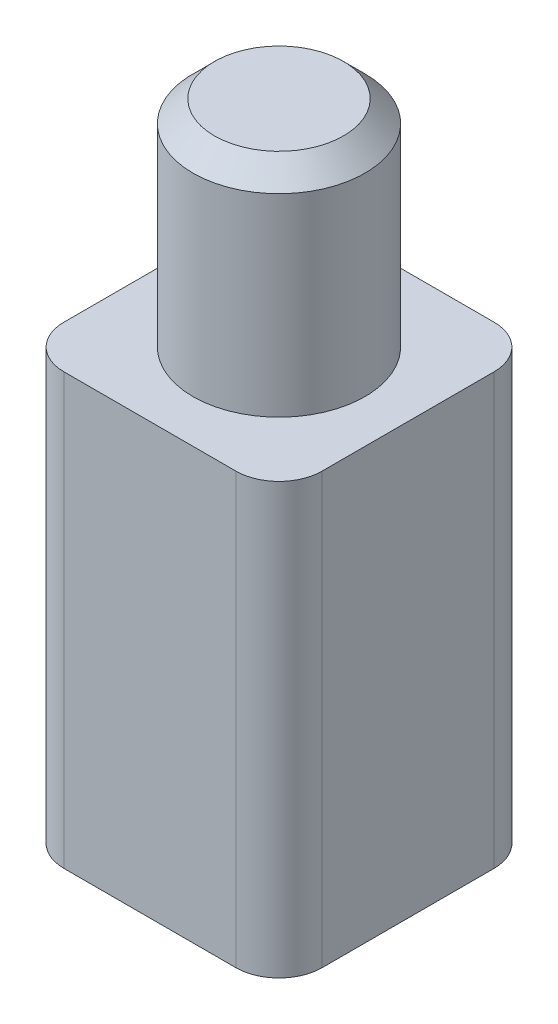
ISO-10303-21;
HEADER;
FILE_DESCRIPTION(('STEP AP214'),'2;1');
FILE_NAME('part.step','',(''),(''),'','','');
FILE_SCHEMA(('AUTOMOTIVE_DESIGN { 1 0 10303 214 1 1 1 1 }'));
ENDSEC;
DATA;
#1=APPLICATION_CONTEXT('core data for automotive mechanical design processes');
#2=APPLICATION_PROTOCOL_DEFINITION('international standard','automotive_design',2000,#1);
#3=PRODUCT_CONTEXT('',#1,'mechanical');
#4=PRODUCT('Part','Part','',(#3));
#5=PRODUCT_RELATED_PRODUCT_CATEGORY('part','',(#4));
#6=PRODUCT_DEFINITION_FORMATION('','',#4);
#7=PRODUCT_DEFINITION_CONTEXT('part definition',#1,'design');
#8=PRODUCT_DEFINITION('design','',#6,#7);
#9=PRODUCT_DEFINITION_SHAPE('','',#8);
#10=(LENGTH_UNIT() NAMED_UNIT(*) SI_UNIT(.MILLI.,.METRE.));
#11=(NAMED_UNIT(*) PLANE_ANGLE_UNIT() SI_UNIT($,.RADIAN.));
#12=(NAMED_UNIT(*) SI_UNIT($,.STERADIAN.) SOLID_ANGLE_UNIT());
#13=UNCERTAINTY_MEASURE_WITH_UNIT(LENGTH_MEASURE(1.E-05),#10,'distance_accuracy_value','');
#14=(GEOMETRIC_REPRESENTATION_CONTEXT(3) GLOBAL_UNCERTAINTY_ASSIGNED_CONTEXT((#13)) GLOBAL_UNIT_ASSIGNED_CONTEXT((#10,
#11,#12)) REPRESENTATION_CONTEXT('',''));
#15=CARTESIAN_POINT('',(0.,0.,0.));
#16=DIRECTION('',(0.,0.,1.));
#17=DIRECTION('',(1.,0.,0.));
#18=AXIS2_PLACEMENT_3D('',#15,#16,#17);
#19=CARTESIAN_POINT('',(-30.,100.,-30.));
#20=DIRECTION('',(0.,0.,-1.));
#21=DIRECTION('',(-1.,0.,0.));
#22=AXIS2_PLACEMENT_3D('',#19,#20,#21);
#23=PLANE('',#22);
#24=DIRECTION('',(1.,0.,0.));
#25=VECTOR('',#24,1.);
#26=CARTESIAN_POINT('',(-30.,100.,-30.));
#27=LINE('',#26,#25);
#28=CARTESIAN_POINT('',(-20.,100.,-30.));
#29=VERTEX_POINT('',#28);
#30=CARTESIAN_POINT('',(20.,100.,-30.));
#31=VERTEX_POINT('',#30);
#32=EDGE_CURVE('E348',#29,#31,#27,.T.);
#33=ORIENTED_EDGE('',*,*,#32,.T.);
#34=DIRECTION('',(0.,-1.,0.));
#35=VECTOR('',#34,1.);
#36=CARTESIAN_POINT('',(20.,0.,-30.));
#37=LINE('',#36,#35);
#38=CARTESIAN_POINT('',(20.,0.,-30.));
#39=VERTEX_POINT('',#38);
#40=EDGE_CURVE('E174',#31,#39,#37,.T.);
#41=ORIENTED_EDGE('',*,*,#40,.T.);
#42=DIRECTION('',(1.,0.,0.));
#43=VECTOR('',#42,1.);
#44=CARTESIAN_POINT('',(-30.,0.,-30.));
#45=LINE('',#44,#43);
#46=CARTESIAN_POINT('',(-20.,0.,-30.));
#47=VERTEX_POINT('',#46);
#48=EDGE_CURVE('E158',#47,#39,#45,.T.);
#49=ORIENTED_EDGE('',*,*,#48,.F.);
#50=DIRECTION('',(0.,-1.,0.));
#51=VECTOR('',#50,1.);
#52=CARTESIAN_POINT('',(-20.,100.,-30.));
#53=LINE('',#52,#51);
#54=EDGE_CURVE('E171',#47,#29,#53,.F.);
#55=ORIENTED_EDGE('',*,*,#54,.T.);
#56=EDGE_LOOP('',(#33,#41,#49,#55));
#57=FACE_BOUND('',#56,.T.);
#58=ADVANCED_FACE('F39',(#57),#23,.T.);
#59=CARTESIAN_POINT('',(-30.,100.,30.));
#60=DIRECTION('',(-1.,0.,0.));
#61=DIRECTION('',(0.,0.,1.));
#62=AXIS2_PLACEMENT_3D('',#59,#60,#61);
#63=PLANE('',#62);
#64=DIRECTION('',(0.,0.,-1.));
#65=VECTOR('',#64,1.);
#66=CARTESIAN_POINT('',(-30.,100.,30.));
#67=LINE('',#66,#65);
#68=CARTESIAN_POINT('',(-30.,100.,20.));
#69=VERTEX_POINT('',#68);
#70=CARTESIAN_POINT('',(-30.,100.,-20.));
#71=VERTEX_POINT('',#70);
#72=EDGE_CURVE('E186',#69,#71,#67,.T.);
#73=ORIENTED_EDGE('',*,*,#72,.T.);
#74=DIRECTION('',(0.,-1.,0.));
#75=VECTOR('',#74,1.);
#76=CARTESIAN_POINT('',(-30.,100.,-20.));
#77=LINE('',#76,#75);
#78=CARTESIAN_POINT('',(-30.,0.,-20.));
#79=VERTEX_POINT('',#78);
#80=EDGE_CURVE('E208',#71,#79,#77,.T.);
#81=ORIENTED_EDGE('',*,*,#80,.T.);
#82=DIRECTION('',(0.,0.,-1.));
#83=VECTOR('',#82,1.);
#84=CARTESIAN_POINT('',(-30.,0.,30.));
#85=LINE('',#84,#83);
#86=CARTESIAN_POINT('',(-30.,0.,20.));
#87=VERTEX_POINT('',#86);
#88=EDGE_CURVE('E160',#87,#79,#85,.T.);
#89=ORIENTED_EDGE('',*,*,#88,.F.);
#90=DIRECTION('',(0.,-1.,0.));
#91=VECTOR('',#90,1.);
#92=CARTESIAN_POINT('',(-30.,100.,20.));
#93=LINE('',#92,#91);
#94=EDGE_CURVE('E206',#87,#69,#93,.F.);
#95=ORIENTED_EDGE('',*,*,#94,.T.);
#96=EDGE_LOOP('',(#73,#81,#89,#95));
#97=FACE_BOUND('',#96,.T.);
#98=ADVANCED_FACE('F268',(#97),#63,.T.);
#99=CARTESIAN_POINT('',(-30.,100.,30.));
#100=DIRECTION('',(0.,0.,-1.));
#101=DIRECTION('',(-1.,0.,0.));
#102=AXIS2_PLACEMENT_3D('',#99,#100,#101);
#103=PLANE('',#102);
#104=DIRECTION('',(1.,0.,0.));
#105=VECTOR('',#104,1.);
#106=CARTESIAN_POINT('',(-30.,0.,30.));
#107=LINE('',#106,#105);
#108=CARTESIAN_POINT('',(-20.,0.,30.));
#109=VERTEX_POINT('',#108);
#110=CARTESIAN_POINT('',(20.,0.,30.));
#111=VERTEX_POINT('',#110);
#112=EDGE_CURVE('E359',#109,#111,#107,.T.);
#113=ORIENTED_EDGE('',*,*,#112,.T.);
#114=DIRECTION('',(0.,-1.,0.));
#115=VECTOR('',#114,1.);
#116=CARTESIAN_POINT('',(20.,100.,30.));
#117=LINE('',#116,#115);
#118=CARTESIAN_POINT('',(20.,100.,30.));
#119=VERTEX_POINT('',#118);
#120=EDGE_CURVE('E213',#111,#119,#117,.F.);
#121=ORIENTED_EDGE('',*,*,#120,.T.);
#122=DIRECTION('',(1.,0.,0.));
#123=VECTOR('',#122,1.);
#124=CARTESIAN_POINT('',(-30.,100.,30.));
#125=LINE('',#124,#123);
#126=CARTESIAN_POINT('',(-20.,100.,30.));
#127=VERTEX_POINT('',#126);
#128=EDGE_CURVE('E353',#127,#119,#125,.T.);
#129=ORIENTED_EDGE('',*,*,#128,.F.);
#130=DIRECTION('',(0.,-1.,0.));
#131=VECTOR('',#130,1.);
#132=CARTESIAN_POINT('',(-20.,0.,30.));
#133=LINE('',#132,#131);
#134=EDGE_CURVE('E210',#127,#109,#133,.T.);
#135=ORIENTED_EDGE('',*,*,#134,.T.);
#136=EDGE_LOOP('',(#113,#121,#129,#135));
#137=FACE_BOUND('',#136,.T.);
#138=ADVANCED_FACE('F273',(#137),#103,.F.);
#139=CARTESIAN_POINT('',(30.,100.,30.));
#140=DIRECTION('',(-1.,0.,0.));
#141=DIRECTION('',(0.,0.,1.));
#142=AXIS2_PLACEMENT_3D('',#139,#140,#141);
#143=PLANE('',#142);
#144=DIRECTION('',(0.,0.,-1.));
#145=VECTOR('',#144,1.);
#146=CARTESIAN_POINT('',(30.,0.,30.));
#147=LINE('',#146,#145);
#148=CARTESIAN_POINT('',(30.,0.,20.));
#149=VERTEX_POINT('',#148);
#150=CARTESIAN_POINT('',(30.,0.,-20.));
#151=VERTEX_POINT('',#150);
#152=EDGE_CURVE('E175',#149,#151,#147,.T.);
#153=ORIENTED_EDGE('',*,*,#152,.T.);
#154=DIRECTION('',(0.,-1.,0.));
#155=VECTOR('',#154,1.);
#156=CARTESIAN_POINT('',(30.,100.,-20.));
#157=LINE('',#156,#155);
#158=CARTESIAN_POINT('',(30.,100.,-20.));
#159=VERTEX_POINT('',#158);
#160=EDGE_CURVE('E197',#151,#159,#157,.F.);
#161=ORIENTED_EDGE('',*,*,#160,.T.);
#162=DIRECTION('',(0.,0.,-1.));
#163=VECTOR('',#162,1.);
#164=CARTESIAN_POINT('',(30.,100.,30.));
#165=LINE('',#164,#163);
#166=CARTESIAN_POINT('',(30.,100.,20.));
#167=VERTEX_POINT('',#166);
#168=EDGE_CURVE('E350',#167,#159,#165,.T.);
#169=ORIENTED_EDGE('',*,*,#168,.F.);
#170=DIRECTION('',(0.,-1.,0.));
#171=VECTOR('',#170,1.);
#172=CARTESIAN_POINT('',(30.,100.,20.));
#173=LINE('',#172,#171);
#174=EDGE_CURVE('E194',#167,#149,#173,.T.);
#175=ORIENTED_EDGE('',*,*,#174,.T.);
#176=EDGE_LOOP('',(#153,#161,#169,#175));
#177=FACE_BOUND('',#176,.T.);
#178=ADVANCED_FACE('F278',(#177),#143,.F.);
#179=CARTESIAN_POINT('',(0.,100.,0.));
#180=DIRECTION('',(0.,1.,0.));
#181=DIRECTION('',(0.,0.,1.));
#182=AXIS2_PLACEMENT_3D('',#179,#180,#181);
#183=PLANE('',#182);
#184=CARTESIAN_POINT('',(0.,100.,0.));
#185=DIRECTION('',(0.,1.,0.));
#186=DIRECTION('',(0.,0.,1.));
#187=AXIS2_PLACEMENT_3D('',#184,#185,#186);
#188=CIRCLE('',#187,20.);
#189=CARTESIAN_POINT('',(0.,100.,20.));
#190=VERTEX_POINT('',#189);
#191=EDGE_CURVE('E181',#190,#190,#188,.T.);
#192=ORIENTED_EDGE('',*,*,#191,.F.);
#193=EDGE_LOOP('',(#192));
#194=FACE_BOUND('',#193,.T.);
#195=ORIENTED_EDGE('',*,*,#168,.T.);
#196=CARTESIAN_POINT('',(20.,100.,-20.));
#197=DIRECTION('',(0.,1.,0.));
#198=DIRECTION('',(0.,0.,1.));
#199=AXIS2_PLACEMENT_3D('',#196,#197,#198);
#200=CIRCLE('',#199,10.);
#201=EDGE_CURVE('E204',#159,#31,#200,.T.);
#202=ORIENTED_EDGE('',*,*,#201,.T.);
#203=ORIENTED_EDGE('',*,*,#32,.F.);
#204=CARTESIAN_POINT('',(-20.,100.,-20.));
#205=DIRECTION('',(0.,1.,0.));
#206=DIRECTION('',(0.,0.,1.));
#207=AXIS2_PLACEMENT_3D('',#204,#205,#206);
#208=CIRCLE('',#207,10.);
#209=EDGE_CURVE('E180',#29,#71,#208,.T.);
#210=ORIENTED_EDGE('',*,*,#209,.T.);
#211=ORIENTED_EDGE('',*,*,#72,.F.);
#212=CARTESIAN_POINT('',(-20.,100.,20.));
#213=DIRECTION('',(0.,1.,0.));
#214=DIRECTION('',(0.,0.,1.));
#215=AXIS2_PLACEMENT_3D('',#212,#213,#214);
#216=CIRCLE('',#215,10.);
#217=EDGE_CURVE('E199',#69,#127,#216,.T.);
#218=ORIENTED_EDGE('',*,*,#217,.T.);
#219=ORIENTED_EDGE('',*,*,#128,.T.);
#220=CARTESIAN_POINT('',(20.,100.,20.));
#221=DIRECTION('',(0.,1.,0.));
#222=DIRECTION('',(0.,0.,1.));
#223=AXIS2_PLACEMENT_3D('',#220,#221,#222);
#224=CIRCLE('',#223,10.);
#225=EDGE_CURVE('E201',#119,#167,#224,.T.);
#226=ORIENTED_EDGE('',*,*,#225,.T.);
#227=EDGE_LOOP('',(#195,#202,#203,#210,#211,#218,#219,#226));
#228=FACE_BOUND('',#227,.T.);
#229=ADVANCED_FACE('F370',(#194,#228),#183,.T.);
#230=CARTESIAN_POINT('',(0.,0.,0.));
#231=DIRECTION('',(0.,1.,0.));
#232=DIRECTION('',(0.,0.,1.));
#233=AXIS2_PLACEMENT_3D('',#230,#231,#232);
#234=PLANE('',#233);
#235=DIRECTION('',(1.,0.,0.));
#236=VECTOR('',#235,1.);
#237=CARTESIAN_POINT('',(-15.2190002360269,0.,-13.8088616207724));
#238=LINE('',#237,#236);
#239=CARTESIAN_POINT('',(-5.21900023602689,0.,-13.8088616207724));
#240=VERTEX_POINT('',#239);
#241=CARTESIAN_POINT('',(4.7809997639731,0.,-13.8088616207724));
#242=VERTEX_POINT('',#241);
#243=EDGE_CURVE('E340',#240,#242,#238,.T.);
#244=ORIENTED_EDGE('',*,*,#243,.F.);
#245=CARTESIAN_POINT('',(-5.21900023602689,0.,-3.80886162077241));
#246=DIRECTION('',(0.,1.,0.));
#247=DIRECTION('',(0.,0.,1.));
#248=AXIS2_PLACEMENT_3D('',#245,#246,#247);
#249=CIRCLE('',#248,10.);
#250=CARTESIAN_POINT('',(-15.2190002360269,0.,-3.80886162077241));
#251=VERTEX_POINT('',#250);
#252=EDGE_CURVE('E63',#240,#251,#249,.T.);
#253=ORIENTED_EDGE('',*,*,#252,.T.);
#254=DIRECTION('',(0.,0.,-1.));
#255=VECTOR('',#254,1.);
#256=CARTESIAN_POINT('',(-15.2190002360269,0.,16.1911383792276));
#257=LINE('',#256,#255);
#258=CARTESIAN_POINT('',(-15.2190002360269,0.,6.19113837922759));
#259=VERTEX_POINT('',#258);
#260=EDGE_CURVE('E337',#259,#251,#257,.T.);
#261=ORIENTED_EDGE('',*,*,#260,.F.);
#262=CARTESIAN_POINT('',(-5.21900023602689,0.,6.19113837922759));
#263=DIRECTION('',(0.,1.,0.));
#264=DIRECTION('',(0.,0.,1.));
#265=AXIS2_PLACEMENT_3D('',#262,#263,#264);
#266=CIRCLE('',#265,10.);
#267=CARTESIAN_POINT('',(-5.21900023602689,0.,16.1911383792276));
#268=VERTEX_POINT('',#267);
#269=EDGE_CURVE('E244',#259,#268,#266,.T.);
#270=ORIENTED_EDGE('',*,*,#269,.T.);
#271=DIRECTION('',(-1.,0.,0.));
#272=VECTOR('',#271,1.);
#273=CARTESIAN_POINT('',(-15.2190002360269,0.,16.1911383792276));
#274=LINE('',#273,#272);
#275=CARTESIAN_POINT('',(4.7809997639731,0.,16.1911383792276));
#276=VERTEX_POINT('',#275);
#277=EDGE_CURVE('E331',#276,#268,#274,.T.);
#278=ORIENTED_EDGE('',*,*,#277,.F.);
#279=CARTESIAN_POINT('',(4.78099976397311,0.,6.19113837922759));
#280=DIRECTION('',(0.,1.,0.));
#281=DIRECTION('',(0.,0.,1.));
#282=AXIS2_PLACEMENT_3D('',#279,#280,#281);
#283=CIRCLE('',#282,10.);
#284=CARTESIAN_POINT('',(14.7809997639731,0.,6.19113837922759));
#285=VERTEX_POINT('',#284);
#286=EDGE_CURVE('E242',#276,#285,#283,.T.);
#287=ORIENTED_EDGE('',*,*,#286,.T.);
#288=DIRECTION('',(0.,0.,1.));
#289=VECTOR('',#288,1.);
#290=CARTESIAN_POINT('',(14.7809997639731,0.,16.1911383792276));
#291=LINE('',#290,#289);
#292=CARTESIAN_POINT('',(14.7809997639731,0.,-3.80886162077241));
#293=VERTEX_POINT('',#292);
#294=EDGE_CURVE('E343',#293,#285,#291,.T.);
#295=ORIENTED_EDGE('',*,*,#294,.F.);
#296=CARTESIAN_POINT('',(4.78099976397311,0.,-3.80886162077241));
#297=DIRECTION('',(0.,1.,0.));
#298=DIRECTION('',(0.,0.,1.));
#299=AXIS2_PLACEMENT_3D('',#296,#297,#298);
#300=CIRCLE('',#299,10.);
#301=EDGE_CURVE('E55',#293,#242,#300,.T.);
#302=ORIENTED_EDGE('',*,*,#301,.T.);
#303=EDGE_LOOP('',(#244,#253,#261,#270,#278,#287,#295,#302));
#304=FACE_BOUND('',#303,.T.);
#305=ORIENTED_EDGE('',*,*,#48,.T.);
#306=CARTESIAN_POINT('',(20.,0.,-20.));
#307=DIRECTION('',(0.,1.,0.));
#308=DIRECTION('',(0.,0.,1.));
#309=AXIS2_PLACEMENT_3D('',#306,#307,#308);
#310=CIRCLE('',#309,10.);
#311=EDGE_CURVE('E165',#39,#151,#310,.F.);
#312=ORIENTED_EDGE('',*,*,#311,.T.);
#313=ORIENTED_EDGE('',*,*,#152,.F.);
#314=CARTESIAN_POINT('',(20.,0.,20.));
#315=DIRECTION('',(0.,1.,0.));
#316=DIRECTION('',(0.,0.,1.));
#317=AXIS2_PLACEMENT_3D('',#314,#315,#316);
#318=CIRCLE('',#317,10.);
#319=EDGE_CURVE('E166',#149,#111,#318,.F.);
#320=ORIENTED_EDGE('',*,*,#319,.T.);
#321=ORIENTED_EDGE('',*,*,#112,.F.);
#322=CARTESIAN_POINT('',(-20.,0.,20.));
#323=DIRECTION('',(0.,1.,0.));
#324=DIRECTION('',(0.,0.,1.));
#325=AXIS2_PLACEMENT_3D('',#322,#323,#324);
#326=CIRCLE('',#325,10.);
#327=EDGE_CURVE('E183',#109,#87,#326,.F.);
#328=ORIENTED_EDGE('',*,*,#327,.T.);
#329=ORIENTED_EDGE('',*,*,#88,.T.);
#330=CARTESIAN_POINT('',(-20.,0.,-20.));
#331=DIRECTION('',(0.,1.,0.));
#332=DIRECTION('',(0.,0.,1.));
#333=AXIS2_PLACEMENT_3D('',#330,#331,#332);
#334=CIRCLE('',#333,10.);
#335=EDGE_CURVE('E155',#79,#47,#334,.F.);
#336=ORIENTED_EDGE('',*,*,#335,.T.);
#337=EDGE_LOOP('',(#305,#312,#313,#320,#321,#328,#329,#336));
#338=FACE_BOUND('',#337,.T.);
#339=ADVANCED_FACE('F157',(#304,#338),#234,.F.);
#340=CARTESIAN_POINT('',(0.,150.,0.));
#341=DIRECTION('',(0.,-1.,0.));
#342=DIRECTION('',(0.,0.,-1.));
#343=AXIS2_PLACEMENT_3D('',#340,#341,#342);
#344=CYLINDRICAL_SURFACE('',#343,20.);
#345=CARTESIAN_POINT('',(0.,145.,0.));
#346=DIRECTION('',(0.,1.,0.));
#347=DIRECTION('',(0.,0.,1.));
#348=AXIS2_PLACEMENT_3D('',#345,#346,#347);
#349=CIRCLE('',#348,20.);
#350=CARTESIAN_POINT('',(0.,145.,20.));
#351=VERTEX_POINT('',#350);
#352=EDGE_CURVE('E251',#351,#351,#349,.F.);
#353=ORIENTED_EDGE('',*,*,#352,.T.);
#354=EDGE_LOOP('',(#353));
#355=FACE_BOUND('',#354,.T.);
#356=ORIENTED_EDGE('',*,*,#191,.T.);
#357=EDGE_LOOP('',(#356));
#358=FACE_BOUND('',#357,.T.);
#359=ADVANCED_FACE('F389',(#355,#358),#344,.T.);
#360=CARTESIAN_POINT('',(0.,150.,0.));
#361=DIRECTION('',(0.,1.,0.));
#362=DIRECTION('',(0.,0.,1.));
#363=AXIS2_PLACEMENT_3D('',#360,#361,#362);
#364=PLANE('',#363);
#365=CARTESIAN_POINT('',(0.,150.,0.));
#366=DIRECTION('',(0.,1.,0.));
#367=DIRECTION('',(0.,0.,1.));
#368=AXIS2_PLACEMENT_3D('',#365,#366,#367);
#369=CIRCLE('',#368,15.);
#370=CARTESIAN_POINT('',(0.,150.,15.));
#371=VERTEX_POINT('',#370);
#372=EDGE_CURVE('E248',#371,#371,#369,.T.);
#373=ORIENTED_EDGE('',*,*,#372,.T.);
#374=EDGE_LOOP('',(#373));
#375=FACE_BOUND('',#374,.T.);
#376=ADVANCED_FACE('F393',(#375),#364,.T.);
#377=CARTESIAN_POINT('',(-15.2190002360269,30.,16.1911383792276));
#378=DIRECTION('',(-1.,0.,0.));
#379=DIRECTION('',(0.,0.,1.));
#380=AXIS2_PLACEMENT_3D('',#377,#378,#379);
#381=PLANE('',#380);
#382=DIRECTION('',(0.,0.,-1.));
#383=VECTOR('',#382,1.);
#384=CARTESIAN_POINT('',(-15.2190002360269,30.,16.1911383792276));
#385=LINE('',#384,#383);
#386=CARTESIAN_POINT('',(-15.2190002360269,30.,6.19113837922759));
#387=VERTEX_POINT('',#386);
#388=CARTESIAN_POINT('',(-15.2190002360269,30.,-3.80886162077241));
#389=VERTEX_POINT('',#388);
#390=EDGE_CURVE('E324',#387,#389,#385,.T.);
#391=ORIENTED_EDGE('',*,*,#390,.F.);
#392=DIRECTION('',(0.,-1.,0.));
#393=VECTOR('',#392,1.);
#394=CARTESIAN_POINT('',(-15.2190002360269,0.,6.19113837922759));
#395=LINE('',#394,#393);
#396=EDGE_CURVE('E235',#387,#259,#395,.T.);
#397=ORIENTED_EDGE('',*,*,#396,.T.);
#398=ORIENTED_EDGE('',*,*,#260,.T.);
#399=DIRECTION('',(0.,-1.,0.));
#400=VECTOR('',#399,1.);
#401=CARTESIAN_POINT('',(-15.2190002360269,30.,-3.80886162077241));
#402=LINE('',#401,#400);
#403=EDGE_CURVE('E233',#251,#389,#402,.F.);
#404=ORIENTED_EDGE('',*,*,#403,.T.);
#405=EDGE_LOOP('',(#391,#397,#398,#404));
#406=FACE_BOUND('',#405,.T.);
#407=ADVANCED_FACE('F397',(#406),#381,.F.);
#408=CARTESIAN_POINT('',(-15.2190002360269,30.,16.1911383792276));
#409=DIRECTION('',(0.,0.,1.));
#410=DIRECTION('',(1.,0.,0.));
#411=AXIS2_PLACEMENT_3D('',#408,#409,#410);
#412=PLANE('',#411);
#413=DIRECTION('',(-1.,0.,0.));
#414=VECTOR('',#413,1.);
#415=CARTESIAN_POINT('',(-15.2190002360269,30.,16.1911383792276));
#416=LINE('',#415,#414);
#417=CARTESIAN_POINT('',(4.7809997639731,30.,16.1911383792276));
#418=VERTEX_POINT('',#417);
#419=CARTESIAN_POINT('',(-5.21900023602689,30.,16.1911383792276));
#420=VERTEX_POINT('',#419);
#421=EDGE_CURVE('E176',#418,#420,#416,.T.);
#422=ORIENTED_EDGE('',*,*,#421,.F.);
#423=DIRECTION('',(0.,-1.,0.));
#424=VECTOR('',#423,1.);
#425=CARTESIAN_POINT('',(4.78099976397311,0.,16.1911383792276));
#426=LINE('',#425,#424);
#427=EDGE_CURVE('E217',#418,#276,#426,.T.);
#428=ORIENTED_EDGE('',*,*,#427,.T.);
#429=ORIENTED_EDGE('',*,*,#277,.T.);
#430=DIRECTION('',(0.,-1.,0.));
#431=VECTOR('',#430,1.);
#432=CARTESIAN_POINT('',(-5.21900023602689,30.,16.1911383792276));
#433=LINE('',#432,#431);
#434=EDGE_CURVE('E215',#268,#420,#433,.F.);
#435=ORIENTED_EDGE('',*,*,#434,.T.);
#436=EDGE_LOOP('',(#422,#428,#429,#435));
#437=FACE_BOUND('',#436,.T.);
#438=ADVANCED_FACE('F401',(#437),#412,.F.);
#439=CARTESIAN_POINT('',(14.7809997639731,30.,16.1911383792276));
#440=DIRECTION('',(1.,0.,0.));
#441=DIRECTION('',(0.,0.,-1.));
#442=AXIS2_PLACEMENT_3D('',#439,#440,#441);
#443=PLANE('',#442);
#444=ORIENTED_EDGE('',*,*,#294,.T.);
#445=DIRECTION('',(0.,-1.,0.));
#446=VECTOR('',#445,1.);
#447=CARTESIAN_POINT('',(14.7809997639731,30.,6.19113837922759));
#448=LINE('',#447,#446);
#449=CARTESIAN_POINT('',(14.7809997639731,30.,6.19113837922759));
#450=VERTEX_POINT('',#449);
#451=EDGE_CURVE('E223',#285,#450,#448,.F.);
#452=ORIENTED_EDGE('',*,*,#451,.T.);
#453=DIRECTION('',(0.,0.,1.));
#454=VECTOR('',#453,1.);
#455=CARTESIAN_POINT('',(14.7809997639731,30.,16.1911383792276));
#456=LINE('',#455,#454);
#457=CARTESIAN_POINT('',(14.7809997639731,30.,-3.80886162077241));
#458=VERTEX_POINT('',#457);
#459=EDGE_CURVE('E328',#458,#450,#456,.T.);
#460=ORIENTED_EDGE('',*,*,#459,.F.);
#461=DIRECTION('',(0.,-1.,0.));
#462=VECTOR('',#461,1.);
#463=CARTESIAN_POINT('',(14.7809997639731,0.,-3.80886162077241));
#464=LINE('',#463,#462);
#465=EDGE_CURVE('E220',#458,#293,#464,.T.);
#466=ORIENTED_EDGE('',*,*,#465,.T.);
#467=EDGE_LOOP('',(#444,#452,#460,#466));
#468=FACE_BOUND('',#467,.T.);
#469=ADVANCED_FACE('F405',(#468),#443,.F.);
#470=CARTESIAN_POINT('',(-15.2190002360269,30.,-13.8088616207724));
#471=DIRECTION('',(0.,0.,-1.));
#472=DIRECTION('',(-1.,0.,0.));
#473=AXIS2_PLACEMENT_3D('',#470,#471,#472);
#474=PLANE('',#473);
#475=ORIENTED_EDGE('',*,*,#243,.T.);
#476=DIRECTION('',(0.,-1.,0.));
#477=VECTOR('',#476,1.);
#478=CARTESIAN_POINT('',(4.78099976397311,30.,-13.8088616207724));
#479=LINE('',#478,#477);
#480=CARTESIAN_POINT('',(4.7809997639731,30.,-13.8088616207724));
#481=VERTEX_POINT('',#480);
#482=EDGE_CURVE('E240',#242,#481,#479,.F.);
#483=ORIENTED_EDGE('',*,*,#482,.T.);
#484=DIRECTION('',(1.,0.,0.));
#485=VECTOR('',#484,1.);
#486=CARTESIAN_POINT('',(-15.2190002360269,30.,-13.8088616207724));
#487=LINE('',#486,#485);
#488=CARTESIAN_POINT('',(-5.21900023602689,30.,-13.8088616207724));
#489=VERTEX_POINT('',#488);
#490=EDGE_CURVE('E321',#489,#481,#487,.T.);
#491=ORIENTED_EDGE('',*,*,#490,.F.);
#492=DIRECTION('',(0.,-1.,0.));
#493=VECTOR('',#492,1.);
#494=CARTESIAN_POINT('',(-5.21900023602689,0.,-13.8088616207724));
#495=LINE('',#494,#493);
#496=EDGE_CURVE('E238',#489,#240,#495,.T.);
#497=ORIENTED_EDGE('',*,*,#496,.T.);
#498=EDGE_LOOP('',(#475,#483,#491,#497));
#499=FACE_BOUND('',#498,.T.);
#500=ADVANCED_FACE('F326',(#499),#474,.F.);
#501=CARTESIAN_POINT('',(0.,30.,0.));
#502=DIRECTION('',(0.,-1.,0.));
#503=DIRECTION('',(0.,0.,-1.));
#504=AXIS2_PLACEMENT_3D('',#501,#502,#503);
#505=PLANE('',#504);
#506=CARTESIAN_POINT('',(0.,30.,0.));
#507=DIRECTION('',(0.,-1.,0.));
#508=DIRECTION('',(0.,0.,-1.));
#509=AXIS2_PLACEMENT_3D('',#506,#507,#508);
#510=CIRCLE('',#509,12.5);
#511=CARTESIAN_POINT('',(0.,30.,-12.5));
#512=VERTEX_POINT('',#511);
#513=EDGE_CURVE('E341',#512,#512,#510,.T.);
#514=ORIENTED_EDGE('',*,*,#513,.F.);
#515=EDGE_LOOP('',(#514));
#516=FACE_BOUND('',#515,.T.);
#517=ORIENTED_EDGE('',*,*,#459,.T.);
#518=CARTESIAN_POINT('',(4.78099976397311,30.,6.19113837922759));
#519=DIRECTION('',(0.,-1.,0.));
#520=DIRECTION('',(0.,0.,-1.));
#521=AXIS2_PLACEMENT_3D('',#518,#519,#520);
#522=CIRCLE('',#521,10.);
#523=EDGE_CURVE('E231',#450,#418,#522,.T.);
#524=ORIENTED_EDGE('',*,*,#523,.T.);
#525=ORIENTED_EDGE('',*,*,#421,.T.);
#526=CARTESIAN_POINT('',(-5.21900023602689,30.,6.19113837922759));
#527=DIRECTION('',(0.,-1.,0.));
#528=DIRECTION('',(0.,0.,-1.));
#529=AXIS2_PLACEMENT_3D('',#526,#527,#528);
#530=CIRCLE('',#529,10.);
#531=EDGE_CURVE('E229',#420,#387,#530,.T.);
#532=ORIENTED_EDGE('',*,*,#531,.T.);
#533=ORIENTED_EDGE('',*,*,#390,.T.);
#534=CARTESIAN_POINT('',(-5.21900023602689,30.,-3.80886162077241));
#535=DIRECTION('',(0.,-1.,0.));
#536=DIRECTION('',(0.,0.,-1.));
#537=AXIS2_PLACEMENT_3D('',#534,#535,#536);
#538=CIRCLE('',#537,10.);
#539=EDGE_CURVE('E225',#389,#489,#538,.T.);
#540=ORIENTED_EDGE('',*,*,#539,.T.);
#541=ORIENTED_EDGE('',*,*,#490,.T.);
#542=CARTESIAN_POINT('',(4.78099976397311,30.,-3.80886162077241));
#543=DIRECTION('',(0.,-1.,0.));
#544=DIRECTION('',(0.,0.,-1.));
#545=AXIS2_PLACEMENT_3D('',#542,#543,#544);
#546=CIRCLE('',#545,10.);
#547=EDGE_CURVE('E227',#481,#458,#546,.T.);
#548=ORIENTED_EDGE('',*,*,#547,.T.);
#549=EDGE_LOOP('',(#517,#524,#525,#532,#533,#540,#541,#548));
#550=FACE_BOUND('',#549,.T.);
#551=ADVANCED_FACE('F320',(#516,#550),#505,.T.);
#552=CARTESIAN_POINT('',(0.,70.,0.));
#553=DIRECTION('',(0.,-1.,0.));
#554=DIRECTION('',(0.,0.,-1.));
#555=AXIS2_PLACEMENT_3D('',#552,#553,#554);
#556=CYLINDRICAL_SURFACE('',#555,12.5);
#557=CARTESIAN_POINT('',(0.,65.0000000000001,0.));
#558=DIRECTION('',(0.,-1.,0.));
#559=DIRECTION('',(0.,0.,-1.));
#560=AXIS2_PLACEMENT_3D('',#557,#558,#559);
#561=CIRCLE('',#560,12.5);
#562=CARTESIAN_POINT('',(0.,65.0000000000001,-12.5));
#563=VERTEX_POINT('',#562);
#564=EDGE_CURVE('E11',#563,#563,#561,.F.);
#565=ORIENTED_EDGE('',*,*,#564,.T.);
#566=EDGE_LOOP('',(#565));
#567=FACE_BOUND('',#566,.T.);
#568=ORIENTED_EDGE('',*,*,#513,.T.);
#569=EDGE_LOOP('',(#568));
#570=FACE_BOUND('',#569,.T.);
#571=ADVANCED_FACE('F414',(#567,#570),#556,.F.);
#572=CARTESIAN_POINT('',(0.,70.,0.));
#573=DIRECTION('',(0.,-1.,0.));
#574=DIRECTION('',(0.,0.,-1.));
#575=AXIS2_PLACEMENT_3D('',#572,#573,#574);
#576=PLANE('',#575);
#577=CARTESIAN_POINT('',(0.,70.,0.));
#578=DIRECTION('',(0.,-1.,0.));
#579=DIRECTION('',(0.,0.,-1.));
#580=AXIS2_PLACEMENT_3D('',#577,#578,#579);
#581=CIRCLE('',#580,9.61324865405186);
#582=CARTESIAN_POINT('',(0.,70.,-9.61324865405186));
#583=VERTEX_POINT('',#582);
#584=EDGE_CURVE('E48',#583,#583,#581,.T.);
#585=ORIENTED_EDGE('',*,*,#584,.T.);
#586=EDGE_LOOP('',(#585));
#587=FACE_BOUND('',#586,.T.);
#588=ADVANCED_FACE('F256',(#587),#576,.T.);
#589=CARTESIAN_POINT('',(20.,100.,-20.));
#590=DIRECTION('',(0.,1.,0.));
#591=DIRECTION('',(0.,0.,1.));
#592=AXIS2_PLACEMENT_3D('',#589,#590,#591);
#593=CYLINDRICAL_SURFACE('',#592,10.);
#594=ORIENTED_EDGE('',*,*,#201,.F.);
#595=ORIENTED_EDGE('',*,*,#160,.F.);
#596=ORIENTED_EDGE('',*,*,#311,.F.);
#597=ORIENTED_EDGE('',*,*,#40,.F.);
#598=EDGE_LOOP('',(#594,#595,#596,#597));
#599=FACE_BOUND('',#598,.T.);
#600=ADVANCED_FACE('F280',(#599),#593,.T.);
#601=CARTESIAN_POINT('',(-20.,100.,-20.));
#602=DIRECTION('',(0.,-1.,0.));
#603=DIRECTION('',(0.,0.,-1.));
#604=AXIS2_PLACEMENT_3D('',#601,#602,#603);
#605=CYLINDRICAL_SURFACE('',#604,10.);
#606=ORIENTED_EDGE('',*,*,#209,.F.);
#607=ORIENTED_EDGE('',*,*,#54,.F.);
#608=ORIENTED_EDGE('',*,*,#335,.F.);
#609=ORIENTED_EDGE('',*,*,#80,.F.);
#610=EDGE_LOOP('',(#606,#607,#608,#609));
#611=FACE_BOUND('',#610,.T.);
#612=ADVANCED_FACE('F179',(#611),#605,.T.);
#613=CARTESIAN_POINT('',(20.,100.,20.));
#614=DIRECTION('',(0.,-1.,0.));
#615=DIRECTION('',(0.,0.,-1.));
#616=AXIS2_PLACEMENT_3D('',#613,#614,#615);
#617=CYLINDRICAL_SURFACE('',#616,10.);
#618=ORIENTED_EDGE('',*,*,#225,.F.);
#619=ORIENTED_EDGE('',*,*,#120,.F.);
#620=ORIENTED_EDGE('',*,*,#319,.F.);
#621=ORIENTED_EDGE('',*,*,#174,.F.);
#622=EDGE_LOOP('',(#618,#619,#620,#621));
#623=FACE_BOUND('',#622,.T.);
#624=ADVANCED_FACE('F286',(#623),#617,.T.);
#625=CARTESIAN_POINT('',(-20.,100.,20.));
#626=DIRECTION('',(0.,1.,0.));
#627=DIRECTION('',(0.,0.,1.));
#628=AXIS2_PLACEMENT_3D('',#625,#626,#627);
#629=CYLINDRICAL_SURFACE('',#628,10.);
#630=ORIENTED_EDGE('',*,*,#217,.F.);
#631=ORIENTED_EDGE('',*,*,#94,.F.);
#632=ORIENTED_EDGE('',*,*,#327,.F.);
#633=ORIENTED_EDGE('',*,*,#134,.F.);
#634=EDGE_LOOP('',(#630,#631,#632,#633));
#635=FACE_BOUND('',#634,.T.);
#636=ADVANCED_FACE('F289',(#635),#629,.T.);
#637=CARTESIAN_POINT('',(4.78099976397311,30.,6.19113837922759));
#638=DIRECTION('',(0.,1.,0.));
#639=DIRECTION('',(0.,0.,1.));
#640=AXIS2_PLACEMENT_3D('',#637,#638,#639);
#641=CYLINDRICAL_SURFACE('',#640,10.);
#642=ORIENTED_EDGE('',*,*,#523,.F.);
#643=ORIENTED_EDGE('',*,*,#451,.F.);
#644=ORIENTED_EDGE('',*,*,#286,.F.);
#645=ORIENTED_EDGE('',*,*,#427,.F.);
#646=EDGE_LOOP('',(#642,#643,#644,#645));
#647=FACE_BOUND('',#646,.T.);
#648=ADVANCED_FACE('F293',(#647),#641,.F.);
#649=CARTESIAN_POINT('',(-5.21900023602689,30.,6.19113837922759));
#650=DIRECTION('',(0.,1.,0.));
#651=DIRECTION('',(0.,0.,1.));
#652=AXIS2_PLACEMENT_3D('',#649,#650,#651);
#653=CYLINDRICAL_SURFACE('',#652,10.);
#654=ORIENTED_EDGE('',*,*,#531,.F.);
#655=ORIENTED_EDGE('',*,*,#434,.F.);
#656=ORIENTED_EDGE('',*,*,#269,.F.);
#657=ORIENTED_EDGE('',*,*,#396,.F.);
#658=EDGE_LOOP('',(#654,#655,#656,#657));
#659=FACE_BOUND('',#658,.T.);
#660=ADVANCED_FACE('F297',(#659),#653,.F.);
#661=CARTESIAN_POINT('',(4.78099976397311,30.,-3.80886162077241));
#662=DIRECTION('',(0.,1.,0.));
#663=DIRECTION('',(0.,0.,1.));
#664=AXIS2_PLACEMENT_3D('',#661,#662,#663);
#665=CYLINDRICAL_SURFACE('',#664,10.);
#666=ORIENTED_EDGE('',*,*,#547,.F.);
#667=ORIENTED_EDGE('',*,*,#482,.F.);
#668=ORIENTED_EDGE('',*,*,#301,.F.);
#669=ORIENTED_EDGE('',*,*,#465,.F.);
#670=EDGE_LOOP('',(#666,#667,#668,#669));
#671=FACE_BOUND('',#670,.T.);
#672=ADVANCED_FACE('F301',(#671),#665,.F.);
#673=CARTESIAN_POINT('',(-5.21900023602689,30.,-3.80886162077241));
#674=DIRECTION('',(0.,1.,0.));
#675=DIRECTION('',(0.,0.,1.));
#676=AXIS2_PLACEMENT_3D('',#673,#674,#675);
#677=CYLINDRICAL_SURFACE('',#676,10.);
#678=ORIENTED_EDGE('',*,*,#539,.F.);
#679=ORIENTED_EDGE('',*,*,#403,.F.);
#680=ORIENTED_EDGE('',*,*,#252,.F.);
#681=ORIENTED_EDGE('',*,*,#496,.F.);
#682=EDGE_LOOP('',(#678,#679,#680,#681));
#683=FACE_BOUND('',#682,.T.);
#684=ADVANCED_FACE('F264',(#683),#677,.F.);
#685=CARTESIAN_POINT('',(0.,150.,0.));
#686=DIRECTION('',(0.,-1.,0.));
#687=DIRECTION('',(0.,0.,-1.));
#688=AXIS2_PLACEMENT_3D('',#685,#686,#687);
#689=CONICAL_SURFACE('',#688,15.,0.785398163397449);
#690=ORIENTED_EDGE('',*,*,#352,.F.);
#691=EDGE_LOOP('',(#690));
#692=FACE_BOUND('',#691,.T.);
#693=ORIENTED_EDGE('',*,*,#372,.F.);
#694=EDGE_LOOP('',(#693));
#695=FACE_BOUND('',#694,.T.);
#696=ADVANCED_FACE('F259',(#692,#695),#689,.T.);
#697=CARTESIAN_POINT('',(0.,70.,0.));
#698=DIRECTION('',(0.,-1.,0.));
#699=DIRECTION('',(0.,0.,-1.));
#700=AXIS2_PLACEMENT_3D('',#697,#698,#699);
#701=CONICAL_SURFACE('',#700,9.61324865405186,0.523598775598305);
#702=ORIENTED_EDGE('',*,*,#564,.F.);
#703=EDGE_LOOP('',(#702));
#704=FACE_BOUND('',#703,.T.);
#705=ORIENTED_EDGE('',*,*,#584,.F.);
#706=EDGE_LOOP('',(#705));
#707=FACE_BOUND('',#706,.T.);
#708=ADVANCED_FACE('F42',(#704,#707),#701,.F.);
#709=CLOSED_SHELL('',(#58,#98,#138,#178,#229,#339,#359,#376,#407,#438,#469,#500,#551,#571,#588,
#600,#612,#624,#636,#648,#660,#672,#684,#696,#708));
#710=MANIFOLD_SOLID_BREP('B2',#709);
#711=ADVANCED_BREP_SHAPE_REPRESENTATION('',(#18,#710),#14);
#712=SHAPE_DEFINITION_REPRESENTATION(#9,#711);
ENDSEC;
END-ISO-10303-21;
